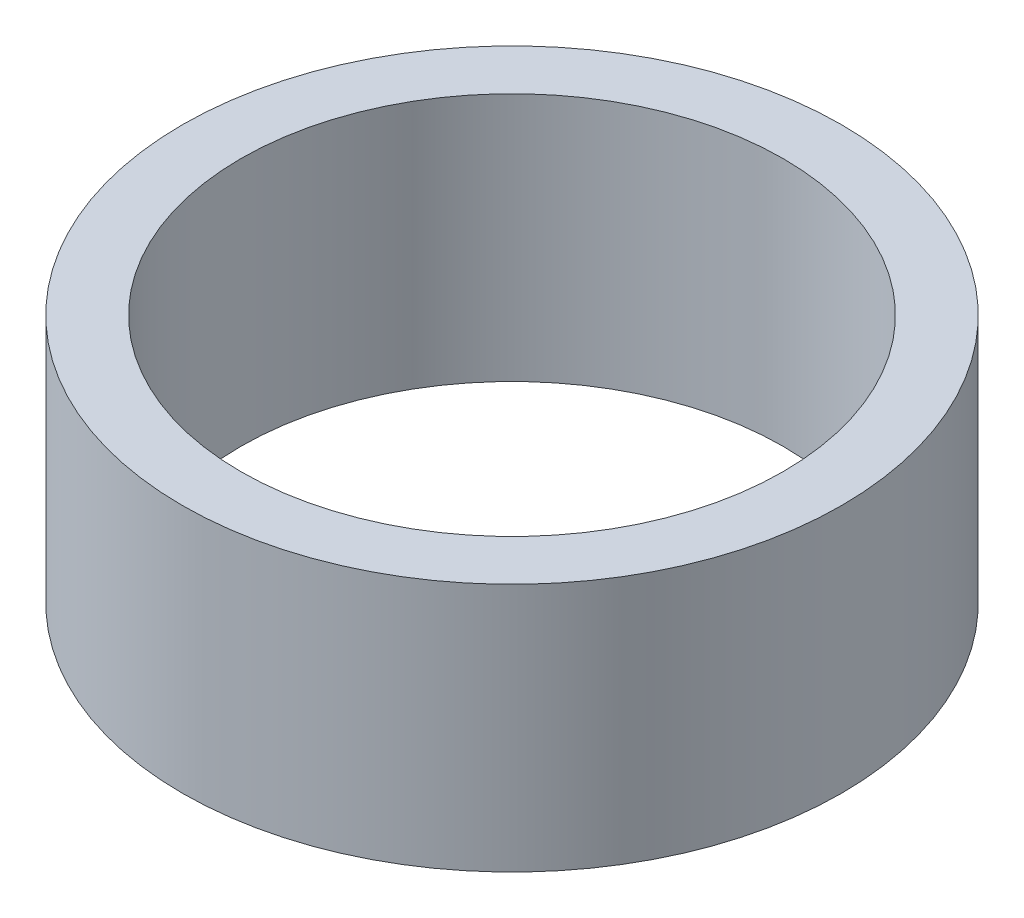
ISO-10303-21;
HEADER;
FILE_DESCRIPTION(('STEP AP214'),'2;1');
FILE_NAME('part.step','',(''),(''),'','','');
FILE_SCHEMA(('AUTOMOTIVE_DESIGN { 1 0 10303 214 1 1 1 1 }'));
ENDSEC;
DATA;
#1=APPLICATION_CONTEXT('core data for automotive mechanical design processes');
#2=APPLICATION_PROTOCOL_DEFINITION('international standard','automotive_design',2000,#1);
#3=PRODUCT_CONTEXT('',#1,'mechanical');
#4=PRODUCT('Part','Part','',(#3));
#5=PRODUCT_RELATED_PRODUCT_CATEGORY('part','',(#4));
#6=PRODUCT_DEFINITION_FORMATION('','',#4);
#7=PRODUCT_DEFINITION_CONTEXT('part definition',#1,'design');
#8=PRODUCT_DEFINITION('design','',#6,#7);
#9=PRODUCT_DEFINITION_SHAPE('','',#8);
#10=(LENGTH_UNIT() NAMED_UNIT(*) SI_UNIT(.MILLI.,.METRE.));
#11=(NAMED_UNIT(*) PLANE_ANGLE_UNIT() SI_UNIT($,.RADIAN.));
#12=(NAMED_UNIT(*) SI_UNIT($,.STERADIAN.) SOLID_ANGLE_UNIT());
#13=UNCERTAINTY_MEASURE_WITH_UNIT(LENGTH_MEASURE(1.E-05),#10,'distance_accuracy_value','');
#14=(GEOMETRIC_REPRESENTATION_CONTEXT(3) GLOBAL_UNCERTAINTY_ASSIGNED_CONTEXT((#13)) GLOBAL_UNIT_ASSIGNED_CONTEXT((#10,
#11,#12)) REPRESENTATION_CONTEXT('',''));
#15=CARTESIAN_POINT('',(0.,0.,0.));
#16=DIRECTION('',(0.,0.,1.));
#17=DIRECTION('',(1.,0.,0.));
#18=AXIS2_PLACEMENT_3D('',#15,#16,#17);
#19=CARTESIAN_POINT('',(0.,3.,0.));
#20=DIRECTION('',(0.,1.,0.));
#21=DIRECTION('',(0.,0.,1.));
#22=AXIS2_PLACEMENT_3D('',#19,#20,#21);
#23=PLANE('',#22);
#24=CARTESIAN_POINT('',(0.,3.,0.));
#25=DIRECTION('',(0.,1.,0.));
#26=DIRECTION('',(0.,0.,1.));
#27=AXIS2_PLACEMENT_3D('',#24,#25,#26);
#28=CIRCLE('',#27,3.96875);
#29=CARTESIAN_POINT('',(0.,3.,3.96875));
#30=VERTEX_POINT('',#29);
#31=EDGE_CURVE('E10',#30,#30,#28,.T.);
#32=ORIENTED_EDGE('',*,*,#31,.T.);
#33=EDGE_LOOP('',(#32));
#34=FACE_BOUND('',#33,.T.);
#35=CARTESIAN_POINT('',(0.,3.,0.));
#36=DIRECTION('',(0.,1.,0.));
#37=DIRECTION('',(0.,0.,1.));
#38=AXIS2_PLACEMENT_3D('',#35,#36,#37);
#39=CIRCLE('',#38,3.2639);
#40=CARTESIAN_POINT('',(0.,3.,3.2639));
#41=VERTEX_POINT('',#40);
#42=EDGE_CURVE('E50',#41,#41,#39,.T.);
#43=ORIENTED_EDGE('',*,*,#42,.F.);
#44=EDGE_LOOP('',(#43));
#45=FACE_BOUND('',#44,.T.);
#46=ADVANCED_FACE('F37',(#34,#45),#23,.T.);
#47=CARTESIAN_POINT('',(0.,0.,0.));
#48=DIRECTION('',(0.,1.,0.));
#49=DIRECTION('',(0.,0.,1.));
#50=AXIS2_PLACEMENT_3D('',#47,#48,#49);
#51=PLANE('',#50);
#52=CARTESIAN_POINT('',(0.,0.,0.));
#53=DIRECTION('',(0.,1.,0.));
#54=DIRECTION('',(0.,0.,1.));
#55=AXIS2_PLACEMENT_3D('',#52,#53,#54);
#56=CIRCLE('',#55,3.96875);
#57=CARTESIAN_POINT('',(0.,0.,3.96875));
#58=VERTEX_POINT('',#57);
#59=EDGE_CURVE('E41',#58,#58,#56,.T.);
#60=ORIENTED_EDGE('',*,*,#59,.F.);
#61=EDGE_LOOP('',(#60));
#62=FACE_BOUND('',#61,.T.);
#63=CARTESIAN_POINT('',(0.,0.,0.));
#64=DIRECTION('',(0.,1.,0.));
#65=DIRECTION('',(0.,0.,1.));
#66=AXIS2_PLACEMENT_3D('',#63,#64,#65);
#67=CIRCLE('',#66,3.2639);
#68=CARTESIAN_POINT('',(0.,0.,3.2639));
#69=VERTEX_POINT('',#68);
#70=EDGE_CURVE('E52',#69,#69,#67,.T.);
#71=ORIENTED_EDGE('',*,*,#70,.T.);
#72=EDGE_LOOP('',(#71));
#73=FACE_BOUND('',#72,.T.);
#74=ADVANCED_FACE('F64',(#62,#73),#51,.F.);
#75=CARTESIAN_POINT('',(0.,3.,0.));
#76=DIRECTION('',(0.,-1.,0.));
#77=DIRECTION('',(0.,0.,-1.));
#78=AXIS2_PLACEMENT_3D('',#75,#76,#77);
#79=CYLINDRICAL_SURFACE('',#78,3.96875);
#80=ORIENTED_EDGE('',*,*,#31,.F.);
#81=EDGE_LOOP('',(#80));
#82=FACE_BOUND('',#81,.T.);
#83=ORIENTED_EDGE('',*,*,#59,.T.);
#84=EDGE_LOOP('',(#83));
#85=FACE_BOUND('',#84,.T.);
#86=ADVANCED_FACE('F39',(#82,#85),#79,.T.);
#87=CARTESIAN_POINT('',(0.,3.,0.));
#88=DIRECTION('',(0.,-1.,0.));
#89=DIRECTION('',(0.,0.,-1.));
#90=AXIS2_PLACEMENT_3D('',#87,#88,#89);
#91=CYLINDRICAL_SURFACE('',#90,3.2639);
#92=ORIENTED_EDGE('',*,*,#42,.T.);
#93=EDGE_LOOP('',(#92));
#94=FACE_BOUND('',#93,.T.);
#95=ORIENTED_EDGE('',*,*,#70,.F.);
#96=EDGE_LOOP('',(#95));
#97=FACE_BOUND('',#96,.T.);
#98=ADVANCED_FACE('F60',(#94,#97),#91,.F.);
#99=CLOSED_SHELL('',(#46,#74,#86,#98));
#100=MANIFOLD_SOLID_BREP('B2',#99);
#101=ADVANCED_BREP_SHAPE_REPRESENTATION('',(#18,#100),#14);
#102=SHAPE_DEFINITION_REPRESENTATION(#9,#101);
ENDSEC;
END-ISO-10303-21;
